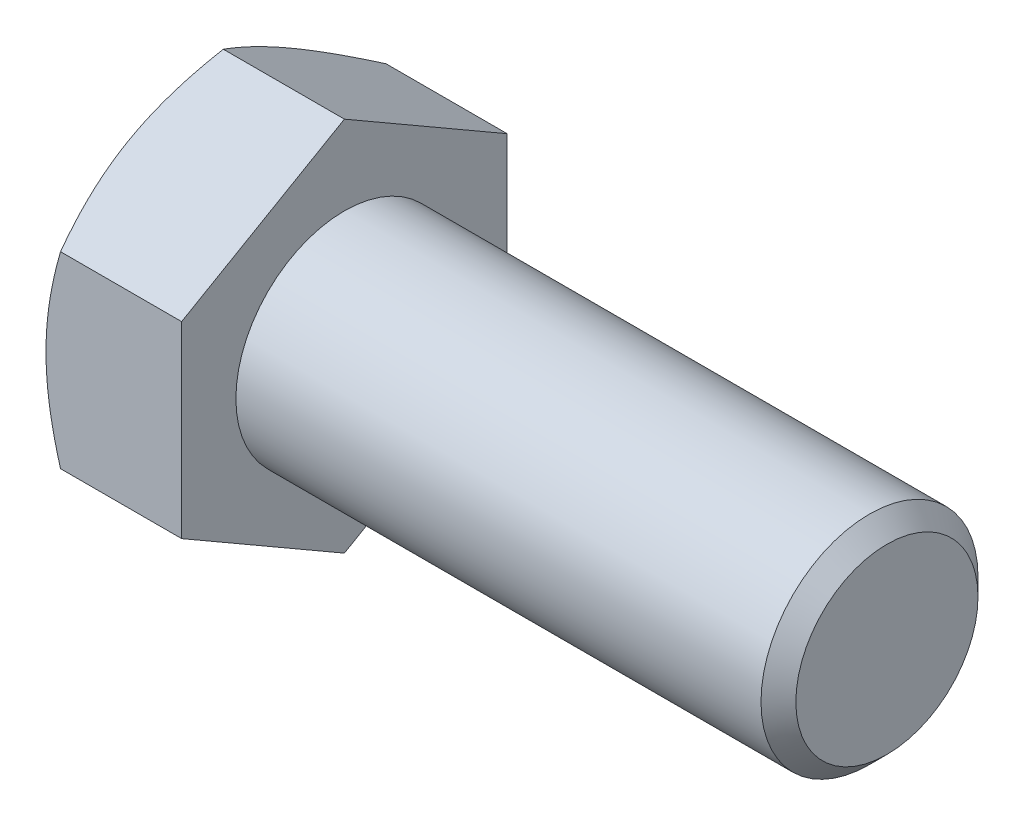
ISO-10303-21;
HEADER;
FILE_DESCRIPTION(('STEP AP214'),'2;1');
FILE_NAME('part.step','',(''),(''),'','','');
FILE_SCHEMA(('AUTOMOTIVE_DESIGN { 1 0 10303 214 1 1 1 1 }'));
ENDSEC;
DATA;
#1=APPLICATION_CONTEXT('core data for automotive mechanical design processes');
#2=APPLICATION_PROTOCOL_DEFINITION('international standard','automotive_design',2000,#1);
#3=PRODUCT_CONTEXT('',#1,'mechanical');
#4=PRODUCT('Part','Part','',(#3));
#5=PRODUCT_RELATED_PRODUCT_CATEGORY('part','',(#4));
#6=PRODUCT_DEFINITION_FORMATION('','',#4);
#7=PRODUCT_DEFINITION_CONTEXT('part definition',#1,'design');
#8=PRODUCT_DEFINITION('design','',#6,#7);
#9=PRODUCT_DEFINITION_SHAPE('','',#8);
#10=(LENGTH_UNIT() NAMED_UNIT(*) SI_UNIT(.MILLI.,.METRE.));
#11=(NAMED_UNIT(*) PLANE_ANGLE_UNIT() SI_UNIT($,.RADIAN.));
#12=(NAMED_UNIT(*) SI_UNIT($,.STERADIAN.) SOLID_ANGLE_UNIT());
#13=UNCERTAINTY_MEASURE_WITH_UNIT(LENGTH_MEASURE(1.E-05),#10,'distance_accuracy_value','');
#14=(GEOMETRIC_REPRESENTATION_CONTEXT(3) GLOBAL_UNCERTAINTY_ASSIGNED_CONTEXT((#13)) GLOBAL_UNIT_ASSIGNED_CONTEXT((#10,
#11,#12)) REPRESENTATION_CONTEXT('',''));
#15=CARTESIAN_POINT('',(0.,0.,0.));
#16=DIRECTION('',(0.,0.,1.));
#17=DIRECTION('',(1.,0.,0.));
#18=AXIS2_PLACEMENT_3D('',#15,#16,#17);
#19=CARTESIAN_POINT('',(7.5,5.19615242270662,-9.));
#20=DIRECTION('',(0.,-0.866025403784438,0.500000000000001));
#21=DIRECTION('',(0.,-0.500000000000001,-0.866025403784438));
#22=AXIS2_PLACEMENT_3D('',#19,#20,#21);
#23=PLANE('',#22);
#24=CARTESIAN_POINT('',(0.803914245071133,10.3924203154671,0.0002));
#25=CARTESIAN_POINT('',(0.737982001874055,10.2782163639798,-0.197607046401216));
#26=CARTESIAN_POINT('',(0.675041409210313,10.1635669787649,-0.396185606649945));
#27=CARTESIAN_POINT('',(0.555968997655536,9.93333715083391,-0.794955366044209));
#28=CARTESIAN_POINT('',(0.499840117752062,9.81775632901308,-0.99514722181845));
#29=CARTESIAN_POINT('',(0.395151960728962,9.58544915100228,-1.3975150570961));
#30=CARTESIAN_POINT('',(0.346610772912787,9.46872074181186,-1.5996945925006));
#31=CARTESIAN_POINT('',(0.258148516787921,9.23447001335913,-2.00542875589074));
#32=CARTESIAN_POINT('',(0.218225687483273,9.11694786135374,-2.20898309417891));
#33=CARTESIAN_POINT('',(0.148684674147113,8.88408932604662,-2.61230590830691));
#34=CARTESIAN_POINT('',(0.118837502847799,8.76877014301847,-2.812044592399));
#35=CARTESIAN_POINT('',(0.0687933098590814,8.53761579013205,-3.21241567598899));
#36=CARTESIAN_POINT('',(0.0485954355375386,8.42178066677662,-3.4130479949416));
#37=CARTESIAN_POINT('',(0.0183543473973454,8.18990950036671,-3.81466063597382));
#38=CARTESIAN_POINT('',(0.00829960958430177,8.07387383570153,-4.01564030266393));
#39=CARTESIAN_POINT('',(-0.00143766485491891,7.84169571742973,-4.41778459991642));
#40=CARTESIAN_POINT('',(-0.00112052193524512,7.72555326723328,-4.61894922457222));
#41=CARTESIAN_POINT('',(0.00916395215317128,7.50842142195782,-4.9950326125305));
#42=CARTESIAN_POINT('',(0.0178767400303946,7.40741671639993,-5.16997789436029));
#43=CARTESIAN_POINT('',(0.0429773400653671,7.20564389241818,-5.51945867708335));
#44=CARTESIAN_POINT('',(0.0593656695806669,7.10487579040239,-5.69399414955697));
#45=CARTESIAN_POINT('',(0.119656556235828,6.80296159398079,-6.2169248772855));
#46=CARTESIAN_POINT('',(0.174677482341126,6.60234990505054,-6.56439451510491));
#47=CARTESIAN_POINT('',(0.312230476325148,6.1989985076226,-7.263019628754));
#48=CARTESIAN_POINT('',(0.395345618627104,5.99631027619252,-7.61408594368717));
#49=CARTESIAN_POINT('',(0.583982539436458,5.59395639760763,-8.3109833040186));
#50=CARTESIAN_POINT('',(0.689460012893353,5.39428559809852,-8.65682327355628));
#51=CARTESIAN_POINT('',(0.803914245071127,5.19603695265279,-9.0002));
#52=B_SPLINE_CURVE_WITH_KNOTS('',3,(#24,#25,#26,#27,#28,#29,#30,#31,#32,#33,#34,#35,#36,#37,#38,
#39,#40,#41,#42,#43,#44,#45,#46,#47,#48,#49,#50,#51),.UNSPECIFIED.,.F.,.F.,(4,2,2,2,2,2,2,2,2,2,
2,2,2,4),(0.,0.713219249102579,1.42674513853509,2.14194697262263,2.8570025303448,
3.55449749123034,4.25193080859215,4.94857085059645,5.64518936892663,6.25162976378284,
6.85811104066341,8.07193747617895,9.31268391793542,10.5509947443908),.UNSPECIFIED.);
#53=CARTESIAN_POINT('',(0.803847577293367,10.3923048454133,0.));
#54=VERTEX_POINT('',#53);
#55=CARTESIAN_POINT('',(0.,7.79422863405994,-4.50000000000001));
#56=VERTEX_POINT('',#55);
#57=EDGE_CURVE('E51',#54,#56,#52,.T.);
#58=ORIENTED_EDGE('',*,*,#57,.F.);
#59=DIRECTION('',(-1.,0.,0.));
#60=VECTOR('',#59,1.);
#61=CARTESIAN_POINT('',(7.5,10.3923048454133,0.));
#62=LINE('',#61,#60);
#63=CARTESIAN_POINT('',(7.5,10.3923048454133,0.));
#64=VERTEX_POINT('',#63);
#65=EDGE_CURVE('E147',#64,#54,#62,.T.);
#66=ORIENTED_EDGE('',*,*,#65,.F.);
#67=DIRECTION('',(0.,0.500000000000001,0.866025403784438));
#68=VECTOR('',#67,1.);
#69=CARTESIAN_POINT('',(7.5,5.19615242270662,-9.));
#70=LINE('',#69,#68);
#71=CARTESIAN_POINT('',(7.5,5.19615242270662,-9.));
#72=VERTEX_POINT('',#71);
#73=EDGE_CURVE('E238',#72,#64,#70,.T.);
#74=ORIENTED_EDGE('',*,*,#73,.F.);
#75=DIRECTION('',(-1.,0.,0.));
#76=VECTOR('',#75,1.);
#77=CARTESIAN_POINT('',(7.5,5.19615242270662,-9.));
#78=LINE('',#77,#76);
#79=CARTESIAN_POINT('',(0.803847577293361,5.19615242270662,-9.));
#80=VERTEX_POINT('',#79);
#81=EDGE_CURVE('E135',#72,#80,#78,.T.);
#82=ORIENTED_EDGE('',*,*,#81,.T.);
#83=EDGE_CURVE('E129',#56,#80,#52,.T.);
#84=ORIENTED_EDGE('',*,*,#83,.F.);
#85=EDGE_LOOP('',(#58,#66,#74,#82,#84));
#86=FACE_BOUND('',#85,.T.);
#87=ADVANCED_FACE('F35',(#86),#23,.F.);
#88=CARTESIAN_POINT('',(7.5,10.3923048454133,0.));
#89=DIRECTION('',(0.,-0.866025403784438,-0.500000000000001));
#90=DIRECTION('',(0.,0.500000000000001,-0.866025403784438));
#91=AXIS2_PLACEMENT_3D('',#88,#89,#90);
#92=PLANE('',#91);
#93=CARTESIAN_POINT('',(0.803914245071126,5.19603695265279,9.0002));
#94=CARTESIAN_POINT('',(0.737982001874048,5.31024090414013,8.80239295359878));
#95=CARTESIAN_POINT('',(0.675041409210306,5.42489028935503,8.60381439335005));
#96=CARTESIAN_POINT('',(0.555968997655531,5.65512011728599,8.20504463395579));
#97=CARTESIAN_POINT('',(0.499840117752058,5.77070093910682,8.00485277818155));
#98=CARTESIAN_POINT('',(0.395151960728958,6.00300811711761,7.6024849429039));
#99=CARTESIAN_POINT('',(0.346610772912782,6.11973652630803,7.4003054074994));
#100=CARTESIAN_POINT('',(0.258148516787916,6.35398725476077,6.99457124410925));
#101=CARTESIAN_POINT('',(0.218225687483269,6.47150940676615,6.79101690582109));
#102=CARTESIAN_POINT('',(0.148684674147111,6.70436794207328,6.38769409169309));
#103=CARTESIAN_POINT('',(0.118837502847797,6.81968712510142,6.187955407601));
#104=CARTESIAN_POINT('',(0.0687933098590795,7.05084147798785,5.787584324011));
#105=CARTESIAN_POINT('',(0.0485954355375369,7.16667660134328,5.58695200505839));
#106=CARTESIAN_POINT('',(0.0183543473973446,7.39854776775318,5.18533936402618));
#107=CARTESIAN_POINT('',(0.00829960958430167,7.51458343241836,4.98435969733606));
#108=CARTESIAN_POINT('',(-0.00143766485491882,7.74676155069016,4.58221540008358));
#109=CARTESIAN_POINT('',(-0.00112052193524554,7.86290400088662,4.38105077542778));
#110=CARTESIAN_POINT('',(0.00916395215317118,8.08003584616208,4.0049673874695));
#111=CARTESIAN_POINT('',(0.0178767400303952,8.18104055171996,3.83002210563971));
#112=CARTESIAN_POINT('',(0.0429773400653688,8.38281337570172,3.48054132291665));
#113=CARTESIAN_POINT('',(0.0593656695806689,8.4835814777175,3.30600585044303));
#114=CARTESIAN_POINT('',(0.119656556235831,8.7854956741391,2.7830751227145));
#115=CARTESIAN_POINT('',(0.174677482341129,8.98610736306936,2.43560548489509));
#116=CARTESIAN_POINT('',(0.312230476325152,9.38945876049729,1.736980371246));
#117=CARTESIAN_POINT('',(0.395345618627108,9.59214699192737,1.38591405631283));
#118=CARTESIAN_POINT('',(0.583982539436463,9.99450087051226,0.689016695981395));
#119=CARTESIAN_POINT('',(0.689460012893358,10.1941716700214,0.343176726443721));
#120=CARTESIAN_POINT('',(0.803914245071132,10.3924203154671,-0.000200000000000193));
#121=B_SPLINE_CURVE_WITH_KNOTS('',3,(#93,#94,#95,#96,#97,#98,#99,#100,#101,#102,#103,#104,#105,
#106,#107,#108,#109,#110,#111,#112,#113,#114,#115,#116,#117,#118,#119,#120),.UNSPECIFIED.,.F.,
.F.,(4,2,2,2,2,2,2,2,2,2,2,2,2,4),(0.,0.713219249102577,1.42674513853509,2.14194697262263,
2.8570025303448,3.55449749123034,4.25193080859215,4.94857085059645,5.64518936892662,
6.25162976378284,6.8581110406634,8.07193747617894,9.31268391793542,10.5509947443908),.UNSPECIFIED.);
#122=CARTESIAN_POINT('',(0.803847577293361,5.19615242270663,9.));
#123=VERTEX_POINT('',#122);
#124=CARTESIAN_POINT('',(0.,7.79422863405994,4.50000000000001));
#125=VERTEX_POINT('',#124);
#126=EDGE_CURVE('E58',#123,#125,#121,.T.);
#127=ORIENTED_EDGE('',*,*,#126,.F.);
#128=DIRECTION('',(-1.,0.,0.));
#129=VECTOR('',#128,1.);
#130=CARTESIAN_POINT('',(7.5,5.19615242270663,9.));
#131=LINE('',#130,#129);
#132=CARTESIAN_POINT('',(7.5,5.19615242270663,9.));
#133=VERTEX_POINT('',#132);
#134=EDGE_CURVE('E145',#133,#123,#131,.T.);
#135=ORIENTED_EDGE('',*,*,#134,.F.);
#136=DIRECTION('',(0.,-0.500000000000001,0.866025403784438));
#137=VECTOR('',#136,1.);
#138=CARTESIAN_POINT('',(7.5,10.3923048454133,0.));
#139=LINE('',#138,#137);
#140=EDGE_CURVE('E236',#64,#133,#139,.T.);
#141=ORIENTED_EDGE('',*,*,#140,.F.);
#142=ORIENTED_EDGE('',*,*,#65,.T.);
#143=EDGE_CURVE('E162',#125,#54,#121,.T.);
#144=ORIENTED_EDGE('',*,*,#143,.F.);
#145=EDGE_LOOP('',(#127,#135,#141,#142,#144));
#146=FACE_BOUND('',#145,.T.);
#147=ADVANCED_FACE('F168',(#146),#92,.F.);
#148=CARTESIAN_POINT('',(7.5,5.19615242270663,9.));
#149=DIRECTION('',(0.,0.,-1.));
#150=DIRECTION('',(-1.,0.,0.));
#151=AXIS2_PLACEMENT_3D('',#148,#149,#150);
#152=PLANE('',#151);
#153=CARTESIAN_POINT('',(4.50308345116277,-14.1853984650015,9.));
#154=CARTESIAN_POINT('',(4.31054430443783,-13.7903499522352,9.));
#155=CARTESIAN_POINT('',(4.11978647586973,-13.3944187196266,9.));
#156=CARTESIAN_POINT('',(3.74283090620237,-12.6003222266755,9.));
#157=CARTESIAN_POINT('',(3.55663384146594,-12.2021566456113,9.));
#158=CARTESIAN_POINT('',(3.18890856344589,-11.4011783965729,9.));
#159=CARTESIAN_POINT('',(3.0074093906765,-10.9983523517116,9.));
#160=CARTESIAN_POINT('',(2.65153988681449,-10.1895752665153,9.));
#161=CARTESIAN_POINT('',(2.47716923358453,-9.78362436837965,9.));
#162=CARTESIAN_POINT('',(2.13161244926931,-8.95398189189403,9.));
#163=CARTESIAN_POINT('',(1.96074001408349,-8.53015895315935,9.));
#164=CARTESIAN_POINT('',(1.6313841002326,-7.67764040403063,9.));
#165=CARTESIAN_POINT('',(1.47290197976962,-7.24894426532906,9.));
#166=CARTESIAN_POINT('',(1.1723215513794,-6.38672363138017,9.));
#167=CARTESIAN_POINT('',(1.03019194474471,-5.95321016213062,9.));
#168=CARTESIAN_POINT('',(0.766724668389709,-5.07998336095627,9.));
#169=CARTESIAN_POINT('',(0.64538068545207,-4.64027195560257,9.));
#170=CARTESIAN_POINT('',(0.429822600041212,-3.75682505769699,9.));
#171=CARTESIAN_POINT('',(0.335452586446514,-3.31312863828559,9.));
#172=CARTESIAN_POINT('',(0.218090109997794,-2.64336713305662,9.));
#173=CARTESIAN_POINT('',(0.182999862158403,-2.41939560703655,9.));
#174=CARTESIAN_POINT('',(0.12156566735783,-1.97026354386692,9.));
#175=CARTESIAN_POINT('',(0.0952208701204452,-1.7451031244712,9.));
#176=CARTESIAN_POINT('',(0.052145147227862,-1.29693480879163,9.));
#177=CARTESIAN_POINT('',(0.0352889798642686,-1.07393900194963,9.));
#178=CARTESIAN_POINT('',(0.0110310639342788,-0.627433600763165,9.));
#179=CARTESIAN_POINT('',(0.00362915208926388,-0.403924015358644,9.));
#180=CARTESIAN_POINT('',(-0.00154262379217611,0.0432079361744758,9.));
#181=CARTESIAN_POINT('',(0.000687480645622422,0.266830301931546,9.));
#182=CARTESIAN_POINT('',(0.0147226077234483,0.713776872824048,9.));
#183=CARTESIAN_POINT('',(0.0265280659472988,0.937101063932557,9.));
#184=CARTESIAN_POINT('',(0.065650289857184,1.46707211896633,9.));
#185=CARTESIAN_POINT('',(0.0971347677291178,1.773418450568,9.));
#186=CARTESIAN_POINT('',(0.176454333238002,2.38397028008964,9.));
#187=CARTESIAN_POINT('',(0.224291457717819,2.68817550649948,9.));
#188=CARTESIAN_POINT('',(0.389806402965321,3.59715813116673,9.));
#189=CARTESIAN_POINT('',(0.52946189684641,4.1979941265223,9.));
#190=CARTESIAN_POINT('',(0.773331871848964,5.09670706348809,9.));
#191=CARTESIAN_POINT('',(0.861532431142624,5.39919910543193,9.));
#192=CARTESIAN_POINT('',(1.04752099203162,6.00125026101993,9.));
#193=CARTESIAN_POINT('',(1.14530906206942,6.30080935370982,9.));
#194=CARTESIAN_POINT('',(1.34886866039495,6.89708058771339,9.));
#195=CARTESIAN_POINT('',(1.4546378769001,7.19379352557784,9.));
#196=CARTESIAN_POINT('',(1.67287301968739,7.78473287386441,9.));
#197=CARTESIAN_POINT('',(1.78533883473292,8.07895932549667,9.));
#198=CARTESIAN_POINT('',(2.07523735271453,8.81619444901847,9.));
#199=CARTESIAN_POINT('',(2.25629467011384,9.25777584408894,9.));
#200=CARTESIAN_POINT('',(2.62827522263086,10.1367776511577,9.));
#201=CARTESIAN_POINT('',(2.81919928705197,10.5741977097237,9.));
#202=CARTESIAN_POINT('',(3.20877963371491,11.4457286497122,9.));
#203=CARTESIAN_POINT('',(3.40743823107646,11.8798384930871,9.));
#204=CARTESIAN_POINT('',(3.81079737205717,12.7452179469075,9.));
#205=CARTESIAN_POINT('',(4.01549773502308,13.1764876418049,9.));
#206=CARTESIAN_POINT('',(4.43000777500987,14.0372827141757,9.));
#207=CARTESIAN_POINT('',(4.63982402220294,14.466804921625,9.));
#208=CARTESIAN_POINT('',(5.06336871339291,15.3239162694583,9.));
#209=CARTESIAN_POINT('',(5.27709718099328,15.7515053981603,9.));
#210=CARTESIAN_POINT('',(5.70771289609102,16.6049951424422,9.));
#211=CARTESIAN_POINT('',(5.92459958876704,17.0308960382694,9.));
#212=CARTESIAN_POINT('',(6.36101693257489,17.8813418239716,9.));
#213=CARTESIAN_POINT('',(6.58054759472945,18.305886708184,9.));
#214=CARTESIAN_POINT('',(7.20096689356043,19.4981240117253,9.));
#215=CARTESIAN_POINT('',(7.60436223424865,20.2645118375987,9.));
#216=CARTESIAN_POINT('',(8.41646747703506,21.7945065925678,9.));
#217=CARTESIAN_POINT('',(8.82517763220602,22.558113387008,9.));
#218=CARTESIAN_POINT('',(9.64538992118461,24.08088542414,9.));
#219=CARTESIAN_POINT('',(10.0568800806835,24.8400571209878,9.));
#220=CARTESIAN_POINT('',(10.6764233675492,25.9775231898088,9.));
#221=CARTESIAN_POINT('',(10.8833155902988,26.3564507889065,9.));
#222=CARTESIAN_POINT('',(11.2977907102886,27.1139273756374,9.));
#223=CARTESIAN_POINT('',(11.5053736065156,27.492476363825,9.));
#224=CARTESIAN_POINT('',(11.7132605802834,27.8708583347745,9.));
#225=B_SPLINE_CURVE_WITH_KNOTS('',3,(#153,#154,#155,#156,#157,#158,#159,#160,#161,#162,#163,
#164,#165,#166,#167,#168,#169,#170,#171,#172,#173,#174,#175,#176,#177,#178,#179,#180,#181,#182,
#183,#184,#185,#186,#187,#188,#189,#190,#191,#192,#193,#194,#195,#196,#197,#198,#199,#200,#201,
#202,#203,#204,#205,#206,#207,#208,#209,#210,#211,#212,#213,#214,#215,#216,#217,#218,#219,#220,
#221,#222,#223,#224),.UNSPECIFIED.,.F.,.F.,(4,2,2,2,2,2,2,2,2,2,2,2,2,2,2,2,2,2,2,2,2,2,2,2,2,2,
2,2,2,2,2,2,2,2,2,4),(0.,1.31842765114838,2.6370496560634,3.96247407620815,5.28783853415268,
6.65860358746619,8.02951869129603,9.39776460603693,10.7655942037288,12.1253499441535,
12.8053173169584,13.4852185605779,14.1559216013657,14.8266130586982,15.4973023208461,
16.1680220944284,17.0913849082023,18.0148627755644,19.862742604473,20.8079230410616,
21.75311022551,22.6980246745777,23.6429234321322,25.0745302305723,26.5062575523684,
27.9384167676661,29.3705332036396,30.8045973553514,32.2386701620091,33.6724940065179,
35.1063238307244,37.7045032490067,40.3028068397952,42.8933552129343,44.1885437295509,
45.4837303472314),.UNSPECIFIED.);
#226=CARTESIAN_POINT('',(0.803847577293364,-5.19615242270664,9.));
#227=VERTEX_POINT('',#226);
#228=CARTESIAN_POINT('',(0.,0.,9.));
#229=VERTEX_POINT('',#228);
#230=EDGE_CURVE('E248',#227,#229,#225,.T.);
#231=ORIENTED_EDGE('',*,*,#230,.F.);
#232=DIRECTION('',(-1.,0.,0.));
#233=VECTOR('',#232,1.);
#234=CARTESIAN_POINT('',(7.5,-5.19615242270664,9.));
#235=LINE('',#234,#233);
#236=CARTESIAN_POINT('',(7.5,-5.19615242270664,9.));
#237=VERTEX_POINT('',#236);
#238=EDGE_CURVE('E137',#237,#227,#235,.T.);
#239=ORIENTED_EDGE('',*,*,#238,.F.);
#240=DIRECTION('',(0.,-1.,0.));
#241=VECTOR('',#240,1.);
#242=CARTESIAN_POINT('',(7.5,5.19615242270663,9.));
#243=LINE('',#242,#241);
#244=EDGE_CURVE('E232',#133,#237,#243,.T.);
#245=ORIENTED_EDGE('',*,*,#244,.F.);
#246=ORIENTED_EDGE('',*,*,#134,.T.);
#247=EDGE_CURVE('E186',#229,#123,#225,.T.);
#248=ORIENTED_EDGE('',*,*,#247,.F.);
#249=EDGE_LOOP('',(#231,#239,#245,#246,#248));
#250=FACE_BOUND('',#249,.T.);
#251=ADVANCED_FACE('F254',(#250),#152,.F.);
#252=CARTESIAN_POINT('',(7.5,-10.3923048454133,0.));
#253=DIRECTION('',(0.,0.866025403784438,-0.500000000000001));
#254=DIRECTION('',(0.,0.500000000000001,0.866025403784438));
#255=AXIS2_PLACEMENT_3D('',#252,#253,#254);
#256=PLANE('',#255);
#257=CARTESIAN_POINT('',(0.80391424507114,-10.3924203154671,-0.000200000000000124));
#258=CARTESIAN_POINT('',(0.737982001874061,-10.2782163639798,0.197607046401216));
#259=CARTESIAN_POINT('',(0.675041409210319,-10.1635669787649,0.396185606649945));
#260=CARTESIAN_POINT('',(0.555968997655543,-9.93333715083392,0.794955366044209));
#261=CARTESIAN_POINT('',(0.499840117752069,-9.81775632901309,0.99514722181845));
#262=CARTESIAN_POINT('',(0.395151960728969,-9.58544915100229,1.3975150570961));
#263=CARTESIAN_POINT('',(0.346610772912792,-9.46872074181187,1.5996945925006));
#264=CARTESIAN_POINT('',(0.258148516787926,-9.23447001335914,2.00542875589075));
#265=CARTESIAN_POINT('',(0.21822568748328,-9.11694786135375,2.20898309417891));
#266=CARTESIAN_POINT('',(0.148684674147121,-8.88408932604663,2.61230590830692));
#267=CARTESIAN_POINT('',(0.118837502847806,-8.76877014301848,2.81204459239901));
#268=CARTESIAN_POINT('',(0.0687933098590875,-8.53761579013205,3.212415675989));
#269=CARTESIAN_POINT('',(0.0485954355375451,-8.42178066677663,3.41304799494161));
#270=CARTESIAN_POINT('',(0.0183543473973519,-8.18990950036672,3.81466063597382));
#271=CARTESIAN_POINT('',(0.00829960958430803,-8.07387383570154,4.01564030266394));
#272=CARTESIAN_POINT('',(-0.00143766485491315,-7.84169571742974,4.41778459991643));
#273=CARTESIAN_POINT('',(-0.00112052193523958,-7.72555326723329,4.61894922457223));
#274=CARTESIAN_POINT('',(0.0091639521531772,-7.50842142195783,4.99503261253051));
#275=CARTESIAN_POINT('',(0.017876740030401,-7.40741671639994,5.16997789436029));
#276=CARTESIAN_POINT('',(0.0429773400653737,-7.20564389241819,5.51945867708335));
#277=CARTESIAN_POINT('',(0.0593656695806731,-7.1048757904024,5.69399414955697));
#278=CARTESIAN_POINT('',(0.119656556235833,-6.8029615939808,6.21692487728551));
#279=CARTESIAN_POINT('',(0.174677482341132,-6.60234990505054,6.56439451510492));
#280=CARTESIAN_POINT('',(0.312230476325153,-6.19899850762261,7.263019628754));
#281=CARTESIAN_POINT('',(0.395345618627109,-5.99631027619254,7.61408594368717));
#282=CARTESIAN_POINT('',(0.583982539436461,-5.59395639760764,8.3109833040186));
#283=CARTESIAN_POINT('',(0.689460012893356,-5.39428559809853,8.65682327355628));
#284=CARTESIAN_POINT('',(0.803914245071129,-5.1960369526528,9.0002));
#285=B_SPLINE_CURVE_WITH_KNOTS('',3,(#257,#258,#259,#260,#261,#262,#263,#264,#265,#266,#267,
#268,#269,#270,#271,#272,#273,#274,#275,#276,#277,#278,#279,#280,#281,#282,#283,#284),
.UNSPECIFIED.,.F.,.F.,(4,2,2,2,2,2,2,2,2,2,2,2,2,4),(0.,0.713219249102578,1.42674513853509,
2.14194697262263,2.85700253034481,3.55449749123035,4.25193080859215,4.94857085059646,
5.64518936892664,6.25162976378285,6.85811104066341,8.07193747617895,9.31268391793542,
10.5509947443908),.UNSPECIFIED.);
#286=CARTESIAN_POINT('',(0.803847577293374,-10.3923048454133,0.));
#287=VERTEX_POINT('',#286);
#288=CARTESIAN_POINT('',(0.,-7.79422863405994,4.50000000000001));
#289=VERTEX_POINT('',#288);
#290=EDGE_CURVE('E170',#287,#289,#285,.T.);
#291=ORIENTED_EDGE('',*,*,#290,.F.);
#292=DIRECTION('',(-1.,0.,0.));
#293=VECTOR('',#292,1.);
#294=CARTESIAN_POINT('',(7.5,-10.3923048454133,0.));
#295=LINE('',#294,#293);
#296=CARTESIAN_POINT('',(7.5,-10.3923048454133,0.));
#297=VERTEX_POINT('',#296);
#298=EDGE_CURVE('E134',#297,#287,#295,.T.);
#299=ORIENTED_EDGE('',*,*,#298,.F.);
#300=DIRECTION('',(0.,-0.500000000000001,-0.866025403784438));
#301=VECTOR('',#300,1.);
#302=CARTESIAN_POINT('',(7.5,-10.3923048454133,0.));
#303=LINE('',#302,#301);
#304=EDGE_CURVE('E230',#237,#297,#303,.T.);
#305=ORIENTED_EDGE('',*,*,#304,.F.);
#306=ORIENTED_EDGE('',*,*,#238,.T.);
#307=EDGE_CURVE('E172',#289,#227,#285,.T.);
#308=ORIENTED_EDGE('',*,*,#307,.F.);
#309=EDGE_LOOP('',(#291,#299,#305,#306,#308));
#310=FACE_BOUND('',#309,.T.);
#311=ADVANCED_FACE('F226',(#310),#256,.F.);
#312=CARTESIAN_POINT('',(7.5,-5.19615242270664,-9.));
#313=DIRECTION('',(0.,0.866025403784438,0.500000000000001));
#314=DIRECTION('',(0.,-0.500000000000001,0.866025403784438));
#315=AXIS2_PLACEMENT_3D('',#312,#313,#314);
#316=PLANE('',#315);
#317=CARTESIAN_POINT('',(0.803914245071132,-5.1960369526528,-9.0002));
#318=CARTESIAN_POINT('',(0.737982001874054,-5.31024090414015,-8.80239295359878));
#319=CARTESIAN_POINT('',(0.675041409210312,-5.42489028935504,-8.60381439335005));
#320=CARTESIAN_POINT('',(0.555968997655537,-5.65512011728601,-8.20504463395579));
#321=CARTESIAN_POINT('',(0.499840117752064,-5.77070093910683,-8.00485277818155));
#322=CARTESIAN_POINT('',(0.395151960728964,-6.00300811711763,-7.6024849429039));
#323=CARTESIAN_POINT('',(0.346610772912788,-6.11973652630805,-7.4003054074994));
#324=CARTESIAN_POINT('',(0.258148516787922,-6.35398725476078,-6.99457124410925));
#325=CARTESIAN_POINT('',(0.218225687483276,-6.47150940676617,-6.79101690582109));
#326=CARTESIAN_POINT('',(0.148684674147119,-6.70436794207329,-6.38769409169309));
#327=CARTESIAN_POINT('',(0.118837502847805,-6.81968712510144,-6.187955407601));
#328=CARTESIAN_POINT('',(0.068793309859087,-7.05084147798787,-5.787584324011));
#329=CARTESIAN_POINT('',(0.0485954355375445,-7.16667660134329,-5.58695200505839));
#330=CARTESIAN_POINT('',(0.0183543473973521,-7.3985477677532,-5.18533936402618));
#331=CARTESIAN_POINT('',(0.00829960958430919,-7.51458343241838,-4.98435969733606));
#332=CARTESIAN_POINT('',(-0.00143766485491131,-7.74676155069018,-4.58221540008358));
#333=CARTESIAN_POINT('',(-0.00112052193523806,-7.86290400088663,-4.38105077542778));
#334=CARTESIAN_POINT('',(0.00916395215317918,-8.08003584616209,-4.0049673874695));
#335=CARTESIAN_POINT('',(0.0178767400304037,-8.18104055171998,-3.83002210563971));
#336=CARTESIAN_POINT('',(0.0429773400653775,-8.38281337570174,-3.48054132291665));
#337=CARTESIAN_POINT('',(0.0593656695806775,-8.48358147771752,-3.30600585044303));
#338=CARTESIAN_POINT('',(0.119656556235839,-8.78549567413912,-2.7830751227145));
#339=CARTESIAN_POINT('',(0.174677482341137,-8.98610736306937,-2.43560548489509));
#340=CARTESIAN_POINT('',(0.31223047632516,-9.38945876049731,-1.736980371246));
#341=CARTESIAN_POINT('',(0.395345618627116,-9.59214699192738,-1.38591405631283));
#342=CARTESIAN_POINT('',(0.583982539436471,-9.99450087051228,-0.689016695981395));
#343=CARTESIAN_POINT('',(0.689460012893367,-10.1941716700214,-0.343176726443721));
#344=CARTESIAN_POINT('',(0.80391424507114,-10.3924203154671,0.00019999999999966));
#345=B_SPLINE_CURVE_WITH_KNOTS('',3,(#317,#318,#319,#320,#321,#322,#323,#324,#325,#326,#327,
#328,#329,#330,#331,#332,#333,#334,#335,#336,#337,#338,#339,#340,#341,#342,#343,#344),
.UNSPECIFIED.,.F.,.F.,(4,2,2,2,2,2,2,2,2,2,2,2,2,4),(0.,0.713219249102579,1.42674513853509,
2.14194697262263,2.8570025303448,3.55449749123034,4.25193080859215,4.94857085059645,
5.64518936892663,6.25162976378284,6.85811104066341,8.07193747617894,9.31268391793542,
10.5509947443908),.UNSPECIFIED.);
#346=CARTESIAN_POINT('',(0.803847577293111,-5.19615242270703,-9.));
#347=VERTEX_POINT('',#346);
#348=CARTESIAN_POINT('',(0.,-7.79422863405994,-4.5));
#349=VERTEX_POINT('',#348);
#350=EDGE_CURVE('E111',#347,#349,#345,.T.);
#351=ORIENTED_EDGE('',*,*,#350,.F.);
#352=DIRECTION('',(-1.,0.,0.));
#353=VECTOR('',#352,1.);
#354=CARTESIAN_POINT('',(7.5,-5.19615242270664,-9.));
#355=LINE('',#354,#353);
#356=CARTESIAN_POINT('',(7.5,-5.19615242270664,-9.));
#357=VERTEX_POINT('',#356);
#358=EDGE_CURVE('E125',#357,#347,#355,.T.);
#359=ORIENTED_EDGE('',*,*,#358,.F.);
#360=DIRECTION('',(0.,0.500000000000001,-0.866025403784438));
#361=VECTOR('',#360,1.);
#362=CARTESIAN_POINT('',(7.5,-5.19615242270664,-9.));
#363=LINE('',#362,#361);
#364=EDGE_CURVE('E228',#297,#357,#363,.T.);
#365=ORIENTED_EDGE('',*,*,#364,.F.);
#366=ORIENTED_EDGE('',*,*,#298,.T.);
#367=EDGE_CURVE('E128',#349,#287,#345,.T.);
#368=ORIENTED_EDGE('',*,*,#367,.F.);
#369=EDGE_LOOP('',(#351,#359,#365,#366,#368));
#370=FACE_BOUND('',#369,.T.);
#371=ADVANCED_FACE('F123',(#370),#316,.F.);
#372=CARTESIAN_POINT('',(7.5,5.19615242270662,-9.));
#373=DIRECTION('',(0.,0.,1.));
#374=DIRECTION('',(1.,0.,0.));
#375=AXIS2_PLACEMENT_3D('',#372,#373,#374);
#376=PLANE('',#375);
#377=CARTESIAN_POINT('',(4.50308345116277,-14.1853984650015,-9.));
#378=CARTESIAN_POINT('',(4.31054430443784,-13.7903499522352,-9.));
#379=CARTESIAN_POINT('',(4.11978647586974,-13.3944187196267,-9.));
#380=CARTESIAN_POINT('',(3.74283090620238,-12.6003222266755,-9.));
#381=CARTESIAN_POINT('',(3.55663384146594,-12.2021566456113,-9.));
#382=CARTESIAN_POINT('',(3.1889085634459,-11.4011783965729,-9.));
#383=CARTESIAN_POINT('',(3.00740939067651,-10.9983523517116,-9.));
#384=CARTESIAN_POINT('',(2.65153988681449,-10.1895752665153,-9.));
#385=CARTESIAN_POINT('',(2.47716923358454,-9.78362436837966,-9.));
#386=CARTESIAN_POINT('',(2.13161244926932,-8.95398189189403,-9.));
#387=CARTESIAN_POINT('',(1.96074001408349,-8.53015895315935,-9.));
#388=CARTESIAN_POINT('',(1.6313841002326,-7.67764040403064,-9.));
#389=CARTESIAN_POINT('',(1.47290197976962,-7.24894426532906,-9.));
#390=CARTESIAN_POINT('',(1.1723215513794,-6.38672363138018,-9.));
#391=CARTESIAN_POINT('',(1.03019194474471,-5.95321016213062,-9.));
#392=CARTESIAN_POINT('',(0.766724668389711,-5.07998336095628,-9.));
#393=CARTESIAN_POINT('',(0.645380685452071,-4.64027195560257,-9.));
#394=CARTESIAN_POINT('',(0.429822600041212,-3.756825057697,-9.));
#395=CARTESIAN_POINT('',(0.335452586446514,-3.3131286382856,-9.));
#396=CARTESIAN_POINT('',(0.218090109997796,-2.64336713305663,-9.));
#397=CARTESIAN_POINT('',(0.182999862158405,-2.41939560703655,-9.));
#398=CARTESIAN_POINT('',(0.121565667357832,-1.97026354386693,-9.));
#399=CARTESIAN_POINT('',(0.0952208701204467,-1.74510312447121,-9.));
#400=CARTESIAN_POINT('',(0.0521451472278625,-1.29693480879164,-9.));
#401=CARTESIAN_POINT('',(0.0352889798642686,-1.07393900194963,-9.));
#402=CARTESIAN_POINT('',(0.0110310639342789,-0.62743360076317,-9.));
#403=CARTESIAN_POINT('',(0.00362915208926458,-0.403924015358649,-9.));
#404=CARTESIAN_POINT('',(-0.00154262379217481,0.0432079361744708,-9.));
#405=CARTESIAN_POINT('',(0.000687480645623687,0.266830301931542,-9.));
#406=CARTESIAN_POINT('',(0.014722607723449,0.713776872824044,-9.));
#407=CARTESIAN_POINT('',(0.026528065947299,0.937101063932552,-9.));
#408=CARTESIAN_POINT('',(0.0656502898571837,1.46707211896632,-9.));
#409=CARTESIAN_POINT('',(0.0971347677291178,1.77341845056799,-9.));
#410=CARTESIAN_POINT('',(0.176454333238002,2.38397028008964,-9.));
#411=CARTESIAN_POINT('',(0.224291457717819,2.68817550649947,-9.));
#412=CARTESIAN_POINT('',(0.389806402965321,3.59715813116673,-9.));
#413=CARTESIAN_POINT('',(0.52946189684641,4.19799412652229,-9.));
#414=CARTESIAN_POINT('',(0.773331871848963,5.09670706348808,-9.));
#415=CARTESIAN_POINT('',(0.861532431142624,5.39919910543193,-9.));
#416=CARTESIAN_POINT('',(1.04752099203162,6.00125026101993,-9.));
#417=CARTESIAN_POINT('',(1.14530906206942,6.30080935370982,-9.));
#418=CARTESIAN_POINT('',(1.34886866039495,6.89708058771338,-9.));
#419=CARTESIAN_POINT('',(1.4546378769001,7.19379352557784,-9.));
#420=CARTESIAN_POINT('',(1.67287301968739,7.78473287386441,-9.));
#421=CARTESIAN_POINT('',(1.78533883473292,8.07895932549667,-9.));
#422=CARTESIAN_POINT('',(2.07523735271453,8.81619444901846,-9.));
#423=CARTESIAN_POINT('',(2.25629467011384,9.25777584408893,-9.));
#424=CARTESIAN_POINT('',(2.62827522263085,10.1367776511577,-9.));
#425=CARTESIAN_POINT('',(2.81919928705197,10.5741977097237,-9.));
#426=CARTESIAN_POINT('',(3.20877963371491,11.4457286497122,-9.));
#427=CARTESIAN_POINT('',(3.40743823107646,11.8798384930871,-9.));
#428=CARTESIAN_POINT('',(3.81079737205717,12.7452179469075,-9.));
#429=CARTESIAN_POINT('',(4.01549773502307,13.1764876418049,-9.));
#430=CARTESIAN_POINT('',(4.43000777500987,14.0372827141757,-9.));
#431=CARTESIAN_POINT('',(4.63982402220294,14.466804921625,-9.));
#432=CARTESIAN_POINT('',(5.0633687133929,15.3239162694583,-9.));
#433=CARTESIAN_POINT('',(5.27709718099327,15.7515053981602,-9.));
#434=CARTESIAN_POINT('',(5.70771289609101,16.6049951424422,-9.));
#435=CARTESIAN_POINT('',(5.92459958876704,17.0308960382694,-9.));
#436=CARTESIAN_POINT('',(6.36101693257489,17.8813418239716,-9.));
#437=CARTESIAN_POINT('',(6.58054759472945,18.305886708184,-9.));
#438=CARTESIAN_POINT('',(7.20096689356043,19.4981240117253,-9.));
#439=CARTESIAN_POINT('',(7.60436223424865,20.2645118375987,-9.));
#440=CARTESIAN_POINT('',(8.41646747703506,21.7945065925678,-9.));
#441=CARTESIAN_POINT('',(8.82517763220602,22.558113387008,-9.));
#442=CARTESIAN_POINT('',(9.6453899211846,24.08088542414,-9.));
#443=CARTESIAN_POINT('',(10.0568800806834,24.8400571209878,-9.));
#444=CARTESIAN_POINT('',(10.6764233675492,25.9775231898088,-9.));
#445=CARTESIAN_POINT('',(10.8833155902988,26.3564507889065,-9.));
#446=CARTESIAN_POINT('',(11.2977907102886,27.1139273756374,-9.));
#447=CARTESIAN_POINT('',(11.5053736065156,27.492476363825,-9.));
#448=CARTESIAN_POINT('',(11.7132605802834,27.8708583347745,-9.));
#449=B_SPLINE_CURVE_WITH_KNOTS('',3,(#377,#378,#379,#380,#381,#382,#383,#384,#385,#386,#387,
#388,#389,#390,#391,#392,#393,#394,#395,#396,#397,#398,#399,#400,#401,#402,#403,#404,#405,#406,
#407,#408,#409,#410,#411,#412,#413,#414,#415,#416,#417,#418,#419,#420,#421,#422,#423,#424,#425,
#426,#427,#428,#429,#430,#431,#432,#433,#434,#435,#436,#437,#438,#439,#440,#441,#442,#443,#444,
#445,#446,#447,#448),.UNSPECIFIED.,.F.,.F.,(4,2,2,2,2,2,2,2,2,2,2,2,2,2,2,2,2,2,2,2,2,2,2,2,2,2,
2,2,2,2,2,2,2,2,2,4),(0.,1.31842765114838,2.63704965606341,3.96247407620815,5.28783853415268,
6.6586035874662,8.02951869129603,9.39776460603693,10.7655942037288,12.1253499441535,
12.8053173169584,13.4852185605779,14.1559216013657,14.8266130586982,15.4973023208461,
16.1680220944284,17.0913849082023,18.0148627755644,19.862742604473,20.8079230410616,
21.75311022551,22.6980246745778,23.6429234321322,25.0745302305723,26.5062575523684,
27.9384167676661,29.3705332036396,30.8045973553514,32.2386701620091,33.6724940065179,
35.1063238307244,37.7045032490067,40.3028068397952,42.8933552129343,44.1885437295509,
45.4837303472314),.UNSPECIFIED.);
#450=CARTESIAN_POINT('',(0.,0.,-9.));
#451=VERTEX_POINT('',#450);
#452=EDGE_CURVE('E117',#80,#451,#449,.F.);
#453=ORIENTED_EDGE('',*,*,#452,.F.);
#454=ORIENTED_EDGE('',*,*,#81,.F.);
#455=DIRECTION('',(0.,1.,0.));
#456=VECTOR('',#455,1.);
#457=CARTESIAN_POINT('',(7.5,5.19615242270662,-9.));
#458=LINE('',#457,#456);
#459=EDGE_CURVE('E133',#357,#72,#458,.T.);
#460=ORIENTED_EDGE('',*,*,#459,.F.);
#461=ORIENTED_EDGE('',*,*,#358,.T.);
#462=EDGE_CURVE('E108',#451,#347,#449,.F.);
#463=ORIENTED_EDGE('',*,*,#462,.F.);
#464=EDGE_LOOP('',(#453,#454,#460,#461,#463));
#465=FACE_BOUND('',#464,.T.);
#466=ADVANCED_FACE('F131',(#465),#376,.F.);
#467=CARTESIAN_POINT('',(7.5,10.3923048454133,0.));
#468=DIRECTION('',(1.,0.,0.));
#469=DIRECTION('',(0.,0.,-1.));
#470=AXIS2_PLACEMENT_3D('',#467,#468,#469);
#471=PLANE('',#470);
#472=CARTESIAN_POINT('',(7.5,0.,0.));
#473=DIRECTION('',(1.,0.,0.));
#474=DIRECTION('',(0.,0.,-1.));
#475=AXIS2_PLACEMENT_3D('',#472,#473,#474);
#476=CIRCLE('',#475,6.);
#477=CARTESIAN_POINT('',(7.5,0.,-6.));
#478=VERTEX_POINT('',#477);
#479=EDGE_CURVE('E241',#478,#478,#476,.F.);
#480=ORIENTED_EDGE('',*,*,#479,.T.);
#481=EDGE_LOOP('',(#480));
#482=FACE_BOUND('',#481,.T.);
#483=ORIENTED_EDGE('',*,*,#73,.T.);
#484=ORIENTED_EDGE('',*,*,#140,.T.);
#485=ORIENTED_EDGE('',*,*,#244,.T.);
#486=ORIENTED_EDGE('',*,*,#304,.T.);
#487=ORIENTED_EDGE('',*,*,#364,.T.);
#488=ORIENTED_EDGE('',*,*,#459,.T.);
#489=EDGE_LOOP('',(#483,#484,#485,#486,#487,#488));
#490=FACE_BOUND('',#489,.T.);
#491=ADVANCED_FACE('F256',(#482,#490),#471,.T.);
#492=CARTESIAN_POINT('',(0.,0.,0.));
#493=DIRECTION('',(-1.,0.,0.));
#494=DIRECTION('',(0.,0.,1.));
#495=AXIS2_PLACEMENT_3D('',#492,#493,#494);
#496=CYLINDRICAL_SURFACE('',#495,6.);
#497=ORIENTED_EDGE('',*,*,#479,.F.);
#498=EDGE_LOOP('',(#497));
#499=FACE_BOUND('',#498,.T.);
#500=CARTESIAN_POINT('',(36.536,0.,0.));
#501=DIRECTION('',(-1.,0.,0.));
#502=DIRECTION('',(0.,0.,1.));
#503=AXIS2_PLACEMENT_3D('',#500,#501,#502);
#504=CIRCLE('',#503,6.);
#505=CARTESIAN_POINT('',(36.536,0.,6.));
#506=VERTEX_POINT('',#505);
#507=EDGE_CURVE('E244',#506,#506,#504,.T.);
#508=ORIENTED_EDGE('',*,*,#507,.T.);
#509=EDGE_LOOP('',(#508));
#510=FACE_BOUND('',#509,.T.);
#511=ADVANCED_FACE('F287',(#499,#510),#496,.T.);
#512=CARTESIAN_POINT('',(37.5,0.,0.));
#513=DIRECTION('',(-1.,0.,0.));
#514=DIRECTION('',(0.,0.,1.));
#515=AXIS2_PLACEMENT_3D('',#512,#513,#514);
#516=CONICAL_SURFACE('',#515,5.036,0.785398163397434);
#517=ORIENTED_EDGE('',*,*,#507,.F.);
#518=EDGE_LOOP('',(#517));
#519=FACE_BOUND('',#518,.T.);
#520=CARTESIAN_POINT('',(37.5,0.,0.));
#521=DIRECTION('',(-1.,0.,0.));
#522=DIRECTION('',(0.,0.,1.));
#523=AXIS2_PLACEMENT_3D('',#520,#521,#522);
#524=CIRCLE('',#523,5.036);
#525=CARTESIAN_POINT('',(37.5,0.,5.036));
#526=VERTEX_POINT('',#525);
#527=EDGE_CURVE('E246',#526,#526,#524,.T.);
#528=ORIENTED_EDGE('',*,*,#527,.T.);
#529=EDGE_LOOP('',(#528));
#530=FACE_BOUND('',#529,.T.);
#531=ADVANCED_FACE('F290',(#519,#530),#516,.T.);
#532=CARTESIAN_POINT('',(37.5,0.,0.));
#533=DIRECTION('',(-1.,0.,0.));
#534=DIRECTION('',(0.,0.,1.));
#535=AXIS2_PLACEMENT_3D('',#532,#533,#534);
#536=PLANE('',#535);
#537=ORIENTED_EDGE('',*,*,#527,.F.);
#538=EDGE_LOOP('',(#537));
#539=FACE_BOUND('',#538,.T.);
#540=ADVANCED_FACE('F200',(#539),#536,.F.);
#541=CARTESIAN_POINT('',(0.,0.,0.));
#542=DIRECTION('',(1.,0.,0.));
#543=DIRECTION('',(0.,0.,-1.));
#544=AXIS2_PLACEMENT_3D('',#541,#542,#543);
#545=CONICAL_SURFACE('',#544,9.,1.0471975511966);
#546=ORIENTED_EDGE('',*,*,#350,.T.);
#547=CARTESIAN_POINT('',(0.,0.,0.));
#548=DIRECTION('',(1.,0.,0.));
#549=DIRECTION('',(0.,0.,-1.));
#550=AXIS2_PLACEMENT_3D('',#547,#548,#549);
#551=CIRCLE('',#550,9.);
#552=EDGE_CURVE('E39',#349,#451,#551,.T.);
#553=ORIENTED_EDGE('',*,*,#552,.T.);
#554=ORIENTED_EDGE('',*,*,#462,.T.);
#555=EDGE_LOOP('',(#546,#553,#554));
#556=FACE_BOUND('',#555,.T.);
#557=ADVANCED_FACE('F110',(#556),#545,.T.);
#558=ORIENTED_EDGE('',*,*,#290,.T.);
#559=EDGE_CURVE('E152',#289,#349,#551,.T.);
#560=ORIENTED_EDGE('',*,*,#559,.T.);
#561=ORIENTED_EDGE('',*,*,#367,.T.);
#562=EDGE_LOOP('',(#558,#560,#561));
#563=FACE_BOUND('',#562,.T.);
#564=ADVANCED_FACE('F199',(#563),#545,.T.);
#565=ORIENTED_EDGE('',*,*,#230,.T.);
#566=EDGE_CURVE('E153',#229,#289,#551,.T.);
#567=ORIENTED_EDGE('',*,*,#566,.T.);
#568=ORIENTED_EDGE('',*,*,#307,.T.);
#569=EDGE_LOOP('',(#565,#567,#568));
#570=FACE_BOUND('',#569,.T.);
#571=ADVANCED_FACE('F194',(#570),#545,.T.);
#572=ORIENTED_EDGE('',*,*,#247,.T.);
#573=ORIENTED_EDGE('',*,*,#126,.T.);
#574=CARTESIAN_POINT('',(0.,0.,0.));
#575=DIRECTION('',(-1.,0.,0.));
#576=DIRECTION('',(0.,0.,1.));
#577=AXIS2_PLACEMENT_3D('',#574,#575,#576);
#578=CIRCLE('',#577,9.);
#579=EDGE_CURVE('E118',#229,#125,#578,.T.);
#580=ORIENTED_EDGE('',*,*,#579,.F.);
#581=EDGE_LOOP('',(#572,#573,#580));
#582=FACE_BOUND('',#581,.T.);
#583=ADVANCED_FACE('F198',(#582),#545,.T.);
#584=ORIENTED_EDGE('',*,*,#143,.T.);
#585=ORIENTED_EDGE('',*,*,#57,.T.);
#586=EDGE_CURVE('E44',#56,#125,#551,.T.);
#587=ORIENTED_EDGE('',*,*,#586,.T.);
#588=EDGE_LOOP('',(#584,#585,#587));
#589=FACE_BOUND('',#588,.T.);
#590=ADVANCED_FACE('F161',(#589),#545,.T.);
#591=ORIENTED_EDGE('',*,*,#83,.T.);
#592=ORIENTED_EDGE('',*,*,#452,.T.);
#593=EDGE_CURVE('E11',#451,#56,#551,.T.);
#594=ORIENTED_EDGE('',*,*,#593,.T.);
#595=EDGE_LOOP('',(#591,#592,#594));
#596=FACE_BOUND('',#595,.T.);
#597=ADVANCED_FACE('F259',(#596),#545,.T.);
#598=CARTESIAN_POINT('',(0.,10.3923048454133,0.));
#599=DIRECTION('',(1.,0.,0.));
#600=DIRECTION('',(0.,0.,-1.));
#601=AXIS2_PLACEMENT_3D('',#598,#599,#600);
#602=PLANE('',#601);
#603=ORIENTED_EDGE('',*,*,#593,.F.);
#604=ORIENTED_EDGE('',*,*,#552,.F.);
#605=ORIENTED_EDGE('',*,*,#559,.F.);
#606=ORIENTED_EDGE('',*,*,#566,.F.);
#607=ORIENTED_EDGE('',*,*,#579,.T.);
#608=ORIENTED_EDGE('',*,*,#586,.F.);
#609=EDGE_LOOP('',(#603,#604,#605,#606,#607,#608));
#610=FACE_BOUND('',#609,.T.);
#611=ADVANCED_FACE('F165',(#610),#602,.F.);
#612=CLOSED_SHELL('',(#87,#147,#251,#311,#371,#466,#491,#511,#531,#540,#557,#564,#571,#583,#590,
#597,#611));
#613=MANIFOLD_SOLID_BREP('B2',#612);
#614=ADVANCED_BREP_SHAPE_REPRESENTATION('',(#18,#613),#14);
#615=SHAPE_DEFINITION_REPRESENTATION(#9,#614);
ENDSEC;
END-ISO-10303-21;
